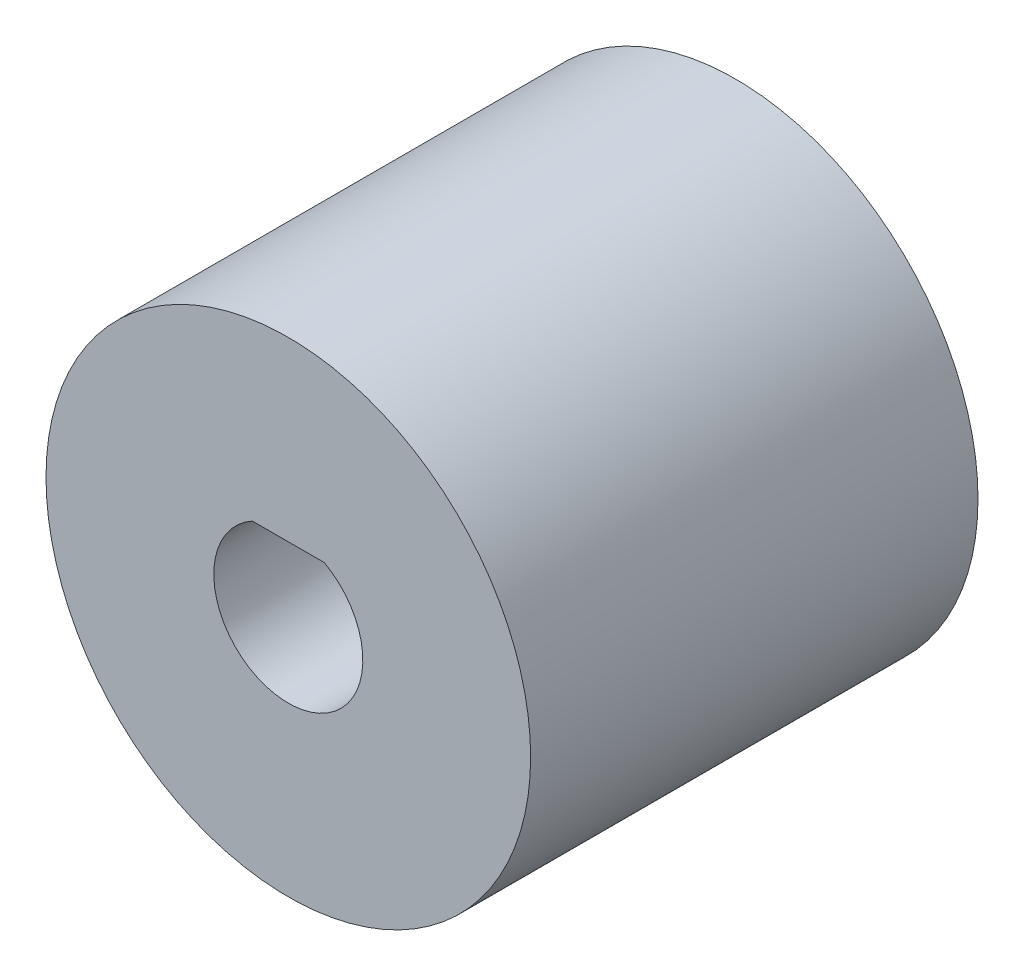
ISO-10303-21;
HEADER;
FILE_DESCRIPTION(('STEP AP214'),'2;1');
FILE_NAME('part.step','',(''),(''),'','','');
FILE_SCHEMA(('AUTOMOTIVE_DESIGN { 1 0 10303 214 1 1 1 1 }'));
ENDSEC;
DATA;
#1=APPLICATION_CONTEXT('core data for automotive mechanical design processes');
#2=APPLICATION_PROTOCOL_DEFINITION('international standard','automotive_design',2000,#1);
#3=PRODUCT_CONTEXT('',#1,'mechanical');
#4=PRODUCT('Part','Part','',(#3));
#5=PRODUCT_RELATED_PRODUCT_CATEGORY('part','',(#4));
#6=PRODUCT_DEFINITION_FORMATION('','',#4);
#7=PRODUCT_DEFINITION_CONTEXT('part definition',#1,'design');
#8=PRODUCT_DEFINITION('design','',#6,#7);
#9=PRODUCT_DEFINITION_SHAPE('','',#8);
#10=(LENGTH_UNIT() NAMED_UNIT(*) SI_UNIT(.MILLI.,.METRE.));
#11=(NAMED_UNIT(*) PLANE_ANGLE_UNIT() SI_UNIT($,.RADIAN.));
#12=(NAMED_UNIT(*) SI_UNIT($,.STERADIAN.) SOLID_ANGLE_UNIT());
#13=UNCERTAINTY_MEASURE_WITH_UNIT(LENGTH_MEASURE(1.E-05),#10,'distance_accuracy_value','');
#14=(GEOMETRIC_REPRESENTATION_CONTEXT(3) GLOBAL_UNCERTAINTY_ASSIGNED_CONTEXT((#13)) GLOBAL_UNIT_ASSIGNED_CONTEXT((#10,
#11,#12)) REPRESENTATION_CONTEXT('',''));
#15=CARTESIAN_POINT('',(0.,0.,0.));
#16=DIRECTION('',(0.,0.,1.));
#17=DIRECTION('',(1.,0.,0.));
#18=AXIS2_PLACEMENT_3D('',#15,#16,#17);
#19=CARTESIAN_POINT('',(-3.33066907387547E-13,-1.11022302462516E-13,-60.7695526216999));
#20=DIRECTION('',(0.,0.,1.));
#21=DIRECTION('',(1.,0.,0.));
#22=AXIS2_PLACEMENT_3D('',#19,#20,#21);
#23=CYLINDRICAL_SURFACE('',#22,12.9999999999998);
#24=CARTESIAN_POINT('',(-3.33066907387547E-13,-1.11022302462516E-13,-23.9999999999999));
#25=DIRECTION('',(0.,0.,1.));
#26=DIRECTION('',(1.,0.,0.));
#27=AXIS2_PLACEMENT_3D('',#24,#25,#26);
#28=CIRCLE('',#27,12.9999999999998);
#29=CARTESIAN_POINT('',(12.9999999999995,-1.11022302462516E-13,-23.9999999999999));
#30=VERTEX_POINT('',#29);
#31=EDGE_CURVE('E11',#30,#30,#28,.F.);
#32=ORIENTED_EDGE('',*,*,#31,.F.);
#33=EDGE_LOOP('',(#32));
#34=FACE_BOUND('',#33,.T.);
#35=CARTESIAN_POINT('',(-3.33066907387547E-13,-1.11022302462516E-13,0.));
#36=DIRECTION('',(0.,0.,1.));
#37=DIRECTION('',(1.,0.,0.));
#38=AXIS2_PLACEMENT_3D('',#35,#36,#37);
#39=CIRCLE('',#38,12.9999999999998);
#40=CARTESIAN_POINT('',(12.9999999999995,-1.11022302462516E-13,0.));
#41=VERTEX_POINT('',#40);
#42=EDGE_CURVE('E85',#41,#41,#39,.T.);
#43=ORIENTED_EDGE('',*,*,#42,.F.);
#44=EDGE_LOOP('',(#43));
#45=FACE_BOUND('',#44,.T.);
#46=ADVANCED_FACE('F42',(#34,#45),#23,.T.);
#47=CARTESIAN_POINT('',(-3.33066907387547E-13,-1.11022302462516E-13,0.));
#48=DIRECTION('',(0.,0.,1.));
#49=DIRECTION('',(1.,0.,0.));
#50=AXIS2_PLACEMENT_3D('',#47,#48,#49);
#51=PLANE('',#50);
#52=CARTESIAN_POINT('',(-3.33066907387547E-13,-1.11022302462516E-13,0.));
#53=DIRECTION('',(0.,0.,1.));
#54=DIRECTION('',(1.,0.,0.));
#55=AXIS2_PLACEMENT_3D('',#52,#53,#54);
#56=CIRCLE('',#55,3.99750000000016);
#57=CARTESIAN_POINT('',(-1.93132240964705,3.49999999999938,0.));
#58=VERTEX_POINT('',#57);
#59=CARTESIAN_POINT('',(1.93132240964705,3.49999999999938,0.));
#60=VERTEX_POINT('',#59);
#61=EDGE_CURVE('E81',#58,#60,#56,.T.);
#62=ORIENTED_EDGE('',*,*,#61,.F.);
#63=DIRECTION('',(-1.,0.,0.));
#64=VECTOR('',#63,1.);
#65=CARTESIAN_POINT('',(1.93132240964705,3.49999999999938,0.));
#66=LINE('',#65,#64);
#67=EDGE_CURVE('E88',#60,#58,#66,.T.);
#68=ORIENTED_EDGE('',*,*,#67,.F.);
#69=EDGE_LOOP('',(#62,#68));
#70=FACE_BOUND('',#69,.T.);
#71=ORIENTED_EDGE('',*,*,#42,.T.);
#72=EDGE_LOOP('',(#71));
#73=FACE_BOUND('',#72,.T.);
#74=ADVANCED_FACE('F93',(#70,#73),#51,.T.);
#75=CARTESIAN_POINT('',(1.93132240964705,3.49999999999938,-60.7695526216999));
#76=DIRECTION('',(0.,1.,0.));
#77=DIRECTION('',(-1.,0.,0.));
#78=AXIS2_PLACEMENT_3D('',#75,#76,#77);
#79=PLANE('',#78);
#80=DIRECTION('',(0.,0.,1.));
#81=VECTOR('',#80,1.);
#82=CARTESIAN_POINT('',(-1.93132240964705,3.49999999999938,-60.7695526216999));
#83=LINE('',#82,#81);
#84=CARTESIAN_POINT('',(-1.93132240964705,3.49999999999938,-23.9999999999999));
#85=VERTEX_POINT('',#84);
#86=EDGE_CURVE('E77',#85,#58,#83,.T.);
#87=ORIENTED_EDGE('',*,*,#86,.F.);
#88=DIRECTION('',(1.,0.,0.));
#89=VECTOR('',#88,1.);
#90=CARTESIAN_POINT('',(1.93132240964705,3.49999999999938,-23.9999999999999));
#91=LINE('',#90,#89);
#92=CARTESIAN_POINT('',(1.93132240964705,3.49999999999938,-23.9999999999999));
#93=VERTEX_POINT('',#92);
#94=EDGE_CURVE('E45',#85,#93,#91,.T.);
#95=ORIENTED_EDGE('',*,*,#94,.T.);
#96=DIRECTION('',(0.,0.,1.));
#97=VECTOR('',#96,1.);
#98=CARTESIAN_POINT('',(1.93132240964705,3.49999999999938,-60.7695526216999));
#99=LINE('',#98,#97);
#100=EDGE_CURVE('E86',#93,#60,#99,.T.);
#101=ORIENTED_EDGE('',*,*,#100,.T.);
#102=ORIENTED_EDGE('',*,*,#67,.T.);
#103=EDGE_LOOP('',(#87,#95,#101,#102));
#104=FACE_BOUND('',#103,.T.);
#105=ADVANCED_FACE('F89',(#104),#79,.F.);
#106=CARTESIAN_POINT('',(-3.33066907387547E-13,-1.11022302462516E-13,-60.7695526216999));
#107=DIRECTION('',(0.,0.,1.));
#108=DIRECTION('',(1.,0.,0.));
#109=AXIS2_PLACEMENT_3D('',#106,#107,#108);
#110=CYLINDRICAL_SURFACE('',#109,3.99750000000016);
#111=ORIENTED_EDGE('',*,*,#100,.F.);
#112=CARTESIAN_POINT('',(-3.33066907387547E-13,-1.11022302462516E-13,-23.9999999999999));
#113=DIRECTION('',(0.,0.,1.));
#114=DIRECTION('',(1.,0.,0.));
#115=AXIS2_PLACEMENT_3D('',#112,#113,#114);
#116=CIRCLE('',#115,3.99750000000016);
#117=EDGE_CURVE('E51',#93,#85,#116,.F.);
#118=ORIENTED_EDGE('',*,*,#117,.T.);
#119=ORIENTED_EDGE('',*,*,#86,.T.);
#120=ORIENTED_EDGE('',*,*,#61,.T.);
#121=EDGE_LOOP('',(#111,#118,#119,#120));
#122=FACE_BOUND('',#121,.T.);
#123=ADVANCED_FACE('F79',(#122),#110,.F.);
#124=CARTESIAN_POINT('',(20.0000000000002,400.,-23.9999999999999));
#125=DIRECTION('',(0.,0.,1.));
#126=DIRECTION('',(1.,0.,0.));
#127=AXIS2_PLACEMENT_3D('',#124,#125,#126);
#128=PLANE('',#127);
#129=ORIENTED_EDGE('',*,*,#31,.T.);
#130=EDGE_LOOP('',(#129));
#131=FACE_BOUND('',#130,.T.);
#132=ORIENTED_EDGE('',*,*,#94,.F.);
#133=ORIENTED_EDGE('',*,*,#117,.F.);
#134=EDGE_LOOP('',(#132,#133));
#135=FACE_BOUND('',#134,.T.);
#136=ADVANCED_FACE('F121',(#131,#135),#128,.F.);
#137=CLOSED_SHELL('',(#46,#74,#105,#123,#136));
#138=MANIFOLD_SOLID_BREP('B2',#137);
#139=ADVANCED_BREP_SHAPE_REPRESENTATION('',(#18,#138),#14);
#140=SHAPE_DEFINITION_REPRESENTATION(#9,#139);
ENDSEC;
END-ISO-10303-21;
